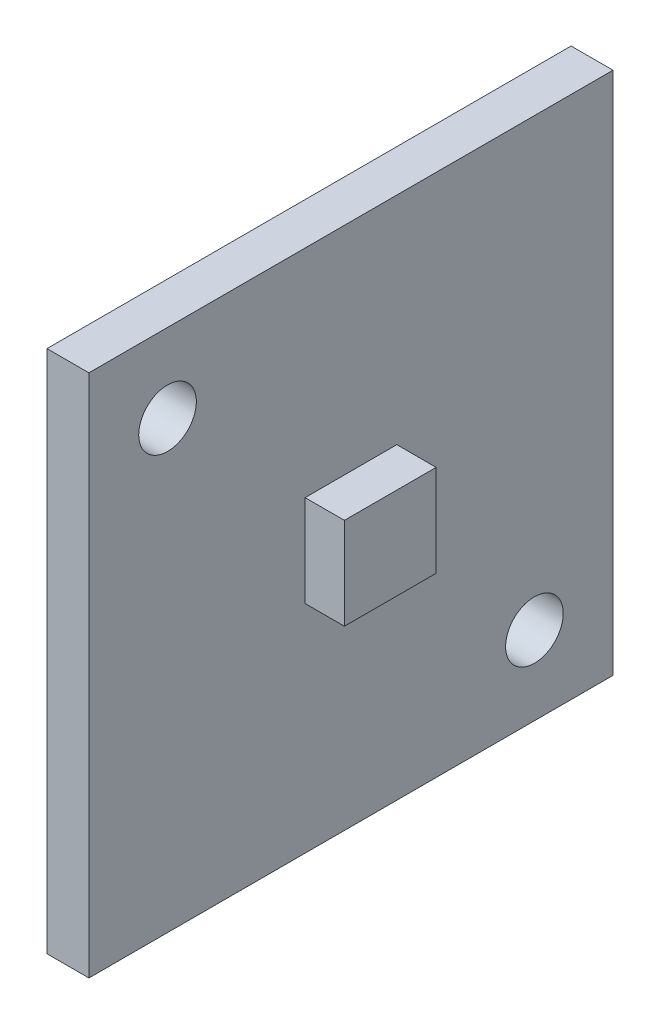
ISO-10303-21;
HEADER;
FILE_DESCRIPTION(('STEP AP214'),'2;1');
FILE_NAME('part.step','',(''),(''),'','','');
FILE_SCHEMA(('AUTOMOTIVE_DESIGN { 1 0 10303 214 1 1 1 1 }'));
ENDSEC;
DATA;
#1=APPLICATION_CONTEXT('core data for automotive mechanical design processes');
#2=APPLICATION_PROTOCOL_DEFINITION('international standard','automotive_design',2000,#1);
#3=PRODUCT_CONTEXT('',#1,'mechanical');
#4=PRODUCT('Part','Part','',(#3));
#5=PRODUCT_RELATED_PRODUCT_CATEGORY('part','',(#4));
#6=PRODUCT_DEFINITION_FORMATION('','',#4);
#7=PRODUCT_DEFINITION_CONTEXT('part definition',#1,'design');
#8=PRODUCT_DEFINITION('design','',#6,#7);
#9=PRODUCT_DEFINITION_SHAPE('','',#8);
#10=(LENGTH_UNIT() NAMED_UNIT(*) SI_UNIT(.MILLI.,.METRE.));
#11=(NAMED_UNIT(*) PLANE_ANGLE_UNIT() SI_UNIT($,.RADIAN.));
#12=(NAMED_UNIT(*) SI_UNIT($,.STERADIAN.) SOLID_ANGLE_UNIT());
#13=UNCERTAINTY_MEASURE_WITH_UNIT(LENGTH_MEASURE(1.E-05),#10,'distance_accuracy_value','');
#14=(GEOMETRIC_REPRESENTATION_CONTEXT(3) GLOBAL_UNCERTAINTY_ASSIGNED_CONTEXT((#13)) GLOBAL_UNIT_ASSIGNED_CONTEXT((#10,
#11,#12)) REPRESENTATION_CONTEXT('',''));
#15=CARTESIAN_POINT('',(0.,0.,0.));
#16=DIRECTION('',(0.,0.,1.));
#17=DIRECTION('',(1.,0.,0.));
#18=AXIS2_PLACEMENT_3D('',#15,#16,#17);
#19=CARTESIAN_POINT('',(0.,0.,0.));
#20=DIRECTION('',(-1.,0.,0.));
#21=DIRECTION('',(0.,0.,1.));
#22=AXIS2_PLACEMENT_3D('',#19,#20,#21);
#23=PLANE('',#22);
#24=CARTESIAN_POINT('',(0.,-7.,-7.));
#25=DIRECTION('',(-1.,0.,0.));
#26=DIRECTION('',(0.,0.,1.));
#27=AXIS2_PLACEMENT_3D('',#24,#25,#26);
#28=CIRCLE('',#27,1.1);
#29=CARTESIAN_POINT('',(0.,-7.,-5.9));
#30=VERTEX_POINT('',#29);
#31=EDGE_CURVE('E226',#30,#30,#28,.F.);
#32=ORIENTED_EDGE('',*,*,#31,.F.);
#33=EDGE_LOOP('',(#32));
#34=FACE_BOUND('',#33,.T.);
#35=CARTESIAN_POINT('',(0.,7.,7.));
#36=DIRECTION('',(-1.,0.,0.));
#37=DIRECTION('',(0.,0.,1.));
#38=AXIS2_PLACEMENT_3D('',#35,#36,#37);
#39=CIRCLE('',#38,1.1);
#40=CARTESIAN_POINT('',(0.,7.,8.1));
#41=VERTEX_POINT('',#40);
#42=EDGE_CURVE('E228',#41,#41,#39,.F.);
#43=ORIENTED_EDGE('',*,*,#42,.F.);
#44=EDGE_LOOP('',(#43));
#45=FACE_BOUND('',#44,.T.);
#46=DIRECTION('',(0.,1.,0.));
#47=VECTOR('',#46,1.);
#48=CARTESIAN_POINT('',(0.,-10.,-10.));
#49=LINE('',#48,#47);
#50=CARTESIAN_POINT('',(0.,-10.,-10.));
#51=VERTEX_POINT('',#50);
#52=CARTESIAN_POINT('',(0.,10.,-10.));
#53=VERTEX_POINT('',#52);
#54=EDGE_CURVE('E135',#51,#53,#49,.T.);
#55=ORIENTED_EDGE('',*,*,#54,.T.);
#56=DIRECTION('',(0.,0.,1.));
#57=VECTOR('',#56,1.);
#58=CARTESIAN_POINT('',(0.,10.,10.));
#59=LINE('',#58,#57);
#60=CARTESIAN_POINT('',(0.,10.,10.));
#61=VERTEX_POINT('',#60);
#62=EDGE_CURVE('E138',#53,#61,#59,.T.);
#63=ORIENTED_EDGE('',*,*,#62,.T.);
#64=DIRECTION('',(0.,-1.,0.));
#65=VECTOR('',#64,1.);
#66=CARTESIAN_POINT('',(0.,-10.,10.));
#67=LINE('',#66,#65);
#68=CARTESIAN_POINT('',(0.,-10.,10.));
#69=VERTEX_POINT('',#68);
#70=EDGE_CURVE('E160',#61,#69,#67,.T.);
#71=ORIENTED_EDGE('',*,*,#70,.T.);
#72=DIRECTION('',(0.,0.,-1.));
#73=VECTOR('',#72,1.);
#74=CARTESIAN_POINT('',(0.,-10.,10.));
#75=LINE('',#74,#73);
#76=EDGE_CURVE('E148',#69,#51,#75,.T.);
#77=ORIENTED_EDGE('',*,*,#76,.T.);
#78=EDGE_LOOP('',(#55,#63,#71,#77));
#79=FACE_BOUND('',#78,.T.);
#80=DIRECTION('',(0.,-1.,0.));
#81=VECTOR('',#80,1.);
#82=CARTESIAN_POINT('',(0.,1.75,1.75));
#83=LINE('',#82,#81);
#84=CARTESIAN_POINT('',(0.,1.75,1.75));
#85=VERTEX_POINT('',#84);
#86=CARTESIAN_POINT('',(0.,-1.75,1.75));
#87=VERTEX_POINT('',#86);
#88=EDGE_CURVE('E61',#85,#87,#83,.T.);
#89=ORIENTED_EDGE('',*,*,#88,.F.);
#90=DIRECTION('',(0.,0.,1.));
#91=VECTOR('',#90,1.);
#92=CARTESIAN_POINT('',(0.,1.75,-1.75));
#93=LINE('',#92,#91);
#94=CARTESIAN_POINT('',(0.,1.75,-1.75));
#95=VERTEX_POINT('',#94);
#96=EDGE_CURVE('E67',#95,#85,#93,.T.);
#97=ORIENTED_EDGE('',*,*,#96,.F.);
#98=DIRECTION('',(0.,1.,0.));
#99=VECTOR('',#98,1.);
#100=CARTESIAN_POINT('',(0.,-1.75,-1.75));
#101=LINE('',#100,#99);
#102=CARTESIAN_POINT('',(0.,-1.75,-1.75));
#103=VERTEX_POINT('',#102);
#104=EDGE_CURVE('E244',#103,#95,#101,.T.);
#105=ORIENTED_EDGE('',*,*,#104,.F.);
#106=DIRECTION('',(0.,0.,-1.));
#107=VECTOR('',#106,1.);
#108=CARTESIAN_POINT('',(0.,-1.75,1.75));
#109=LINE('',#108,#107);
#110=EDGE_CURVE('E234',#87,#103,#109,.T.);
#111=ORIENTED_EDGE('',*,*,#110,.F.);
#112=EDGE_LOOP('',(#89,#97,#105,#111));
#113=FACE_BOUND('',#112,.T.);
#114=ADVANCED_FACE('F50',(#34,#45,#79,#113),#23,.F.);
#115=CARTESIAN_POINT('',(-1.6,-10.,-10.));
#116=DIRECTION('',(0.,0.,-1.));
#117=DIRECTION('',(-1.,0.,0.));
#118=AXIS2_PLACEMENT_3D('',#115,#116,#117);
#119=PLANE('',#118);
#120=ORIENTED_EDGE('',*,*,#54,.F.);
#121=DIRECTION('',(1.,0.,0.));
#122=VECTOR('',#121,1.);
#123=CARTESIAN_POINT('',(-1.6,-10.,-10.));
#124=LINE('',#123,#122);
#125=CARTESIAN_POINT('',(-1.6,-10.,-10.));
#126=VERTEX_POINT('',#125);
#127=EDGE_CURVE('E11',#126,#51,#124,.T.);
#128=ORIENTED_EDGE('',*,*,#127,.F.);
#129=DIRECTION('',(0.,1.,0.));
#130=VECTOR('',#129,1.);
#131=CARTESIAN_POINT('',(-1.6,-10.,-10.));
#132=LINE('',#131,#130);
#133=CARTESIAN_POINT('',(-1.6,10.,-10.));
#134=VERTEX_POINT('',#133);
#135=EDGE_CURVE('E142',#126,#134,#132,.T.);
#136=ORIENTED_EDGE('',*,*,#135,.T.);
#137=DIRECTION('',(1.,0.,0.));
#138=VECTOR('',#137,1.);
#139=CARTESIAN_POINT('',(-1.6,10.,-10.));
#140=LINE('',#139,#138);
#141=EDGE_CURVE('E51',#134,#53,#140,.T.);
#142=ORIENTED_EDGE('',*,*,#141,.T.);
#143=EDGE_LOOP('',(#120,#128,#136,#142));
#144=FACE_BOUND('',#143,.T.);
#145=ADVANCED_FACE('F47',(#144),#119,.T.);
#146=CARTESIAN_POINT('',(-1.6,-10.,10.));
#147=DIRECTION('',(0.,-1.,0.));
#148=DIRECTION('',(0.,0.,-1.));
#149=AXIS2_PLACEMENT_3D('',#146,#147,#148);
#150=PLANE('',#149);
#151=ORIENTED_EDGE('',*,*,#76,.F.);
#152=DIRECTION('',(1.,0.,0.));
#153=VECTOR('',#152,1.);
#154=CARTESIAN_POINT('',(-1.6,-10.,10.));
#155=LINE('',#154,#153);
#156=CARTESIAN_POINT('',(-1.6,-10.,10.));
#157=VERTEX_POINT('',#156);
#158=EDGE_CURVE('E57',#157,#69,#155,.T.);
#159=ORIENTED_EDGE('',*,*,#158,.F.);
#160=DIRECTION('',(0.,0.,-1.));
#161=VECTOR('',#160,1.);
#162=CARTESIAN_POINT('',(-1.6,-10.,10.));
#163=LINE('',#162,#161);
#164=EDGE_CURVE('E155',#157,#126,#163,.T.);
#165=ORIENTED_EDGE('',*,*,#164,.T.);
#166=ORIENTED_EDGE('',*,*,#127,.T.);
#167=EDGE_LOOP('',(#151,#159,#165,#166));
#168=FACE_BOUND('',#167,.T.);
#169=ADVANCED_FACE('F171',(#168),#150,.T.);
#170=CARTESIAN_POINT('',(-1.6,-10.,10.));
#171=DIRECTION('',(0.,0.,1.));
#172=DIRECTION('',(1.,0.,0.));
#173=AXIS2_PLACEMENT_3D('',#170,#171,#172);
#174=PLANE('',#173);
#175=ORIENTED_EDGE('',*,*,#70,.F.);
#176=DIRECTION('',(1.,0.,0.));
#177=VECTOR('',#176,1.);
#178=CARTESIAN_POINT('',(-1.6,10.,10.));
#179=LINE('',#178,#177);
#180=CARTESIAN_POINT('',(-1.6,10.,10.));
#181=VERTEX_POINT('',#180);
#182=EDGE_CURVE('E165',#181,#61,#179,.T.);
#183=ORIENTED_EDGE('',*,*,#182,.F.);
#184=DIRECTION('',(0.,-1.,0.));
#185=VECTOR('',#184,1.);
#186=CARTESIAN_POINT('',(-1.6,-10.,10.));
#187=LINE('',#186,#185);
#188=EDGE_CURVE('E149',#181,#157,#187,.T.);
#189=ORIENTED_EDGE('',*,*,#188,.T.);
#190=ORIENTED_EDGE('',*,*,#158,.T.);
#191=EDGE_LOOP('',(#175,#183,#189,#190));
#192=FACE_BOUND('',#191,.T.);
#193=ADVANCED_FACE('F176',(#192),#174,.T.);
#194=CARTESIAN_POINT('',(-1.6,10.,10.));
#195=DIRECTION('',(0.,1.,0.));
#196=DIRECTION('',(0.,0.,1.));
#197=AXIS2_PLACEMENT_3D('',#194,#195,#196);
#198=PLANE('',#197);
#199=ORIENTED_EDGE('',*,*,#62,.F.);
#200=ORIENTED_EDGE('',*,*,#141,.F.);
#201=DIRECTION('',(0.,0.,1.));
#202=VECTOR('',#201,1.);
#203=CARTESIAN_POINT('',(-1.6,10.,10.));
#204=LINE('',#203,#202);
#205=EDGE_CURVE('E144',#134,#181,#204,.T.);
#206=ORIENTED_EDGE('',*,*,#205,.T.);
#207=ORIENTED_EDGE('',*,*,#182,.T.);
#208=EDGE_LOOP('',(#199,#200,#206,#207));
#209=FACE_BOUND('',#208,.T.);
#210=ADVANCED_FACE('F168',(#209),#198,.T.);
#211=CARTESIAN_POINT('',(-1.6,0.,0.));
#212=DIRECTION('',(-1.,0.,0.));
#213=DIRECTION('',(0.,0.,1.));
#214=AXIS2_PLACEMENT_3D('',#211,#212,#213);
#215=PLANE('',#214);
#216=CARTESIAN_POINT('',(-1.6,-7.,-7.));
#217=DIRECTION('',(1.,0.,0.));
#218=DIRECTION('',(0.,0.,-1.));
#219=AXIS2_PLACEMENT_3D('',#216,#217,#218);
#220=CIRCLE('',#219,1.1);
#221=CARTESIAN_POINT('',(-1.6,-7.,-8.1));
#222=VERTEX_POINT('',#221);
#223=EDGE_CURVE('E229',#222,#222,#220,.T.);
#224=ORIENTED_EDGE('',*,*,#223,.T.);
#225=EDGE_LOOP('',(#224));
#226=FACE_BOUND('',#225,.T.);
#227=CARTESIAN_POINT('',(-1.6,7.,7.));
#228=DIRECTION('',(1.,0.,0.));
#229=DIRECTION('',(0.,0.,-1.));
#230=AXIS2_PLACEMENT_3D('',#227,#228,#229);
#231=CIRCLE('',#230,1.1);
#232=CARTESIAN_POINT('',(-1.6,7.,5.9));
#233=VERTEX_POINT('',#232);
#234=EDGE_CURVE('E249',#233,#233,#231,.T.);
#235=ORIENTED_EDGE('',*,*,#234,.T.);
#236=EDGE_LOOP('',(#235));
#237=FACE_BOUND('',#236,.T.);
#238=ORIENTED_EDGE('',*,*,#135,.F.);
#239=ORIENTED_EDGE('',*,*,#164,.F.);
#240=ORIENTED_EDGE('',*,*,#188,.F.);
#241=ORIENTED_EDGE('',*,*,#205,.F.);
#242=EDGE_LOOP('',(#238,#239,#240,#241));
#243=FACE_BOUND('',#242,.T.);
#244=ADVANCED_FACE('F179',(#226,#237,#243),#215,.T.);
#245=CARTESIAN_POINT('',(1.5,1.75,1.75));
#246=DIRECTION('',(0.,0.,-1.));
#247=DIRECTION('',(-1.,0.,0.));
#248=AXIS2_PLACEMENT_3D('',#245,#246,#247);
#249=PLANE('',#248);
#250=ORIENTED_EDGE('',*,*,#88,.T.);
#251=DIRECTION('',(-1.,0.,0.));
#252=VECTOR('',#251,1.);
#253=CARTESIAN_POINT('',(1.5,-1.75,1.75));
#254=LINE('',#253,#252);
#255=CARTESIAN_POINT('',(1.5,-1.75,1.75));
#256=VERTEX_POINT('',#255);
#257=EDGE_CURVE('E117',#256,#87,#254,.T.);
#258=ORIENTED_EDGE('',*,*,#257,.F.);
#259=DIRECTION('',(0.,-1.,0.));
#260=VECTOR('',#259,1.);
#261=CARTESIAN_POINT('',(1.5,1.75,1.75));
#262=LINE('',#261,#260);
#263=CARTESIAN_POINT('',(1.5,1.75,1.75));
#264=VERTEX_POINT('',#263);
#265=EDGE_CURVE('E124',#264,#256,#262,.T.);
#266=ORIENTED_EDGE('',*,*,#265,.F.);
#267=DIRECTION('',(-1.,0.,0.));
#268=VECTOR('',#267,1.);
#269=CARTESIAN_POINT('',(1.5,1.75,1.75));
#270=LINE('',#269,#268);
#271=EDGE_CURVE('E239',#264,#85,#270,.T.);
#272=ORIENTED_EDGE('',*,*,#271,.T.);
#273=EDGE_LOOP('',(#250,#258,#266,#272));
#274=FACE_BOUND('',#273,.T.);
#275=ADVANCED_FACE('F134',(#274),#249,.F.);
#276=CARTESIAN_POINT('',(1.5,-1.75,1.75));
#277=DIRECTION('',(0.,1.,0.));
#278=DIRECTION('',(0.,0.,1.));
#279=AXIS2_PLACEMENT_3D('',#276,#277,#278);
#280=PLANE('',#279);
#281=ORIENTED_EDGE('',*,*,#110,.T.);
#282=DIRECTION('',(-1.,0.,0.));
#283=VECTOR('',#282,1.);
#284=CARTESIAN_POINT('',(1.5,-1.75,-1.75));
#285=LINE('',#284,#283);
#286=CARTESIAN_POINT('',(1.5,-1.75,-1.75));
#287=VERTEX_POINT('',#286);
#288=EDGE_CURVE('E120',#287,#103,#285,.T.);
#289=ORIENTED_EDGE('',*,*,#288,.F.);
#290=DIRECTION('',(0.,0.,-1.));
#291=VECTOR('',#290,1.);
#292=CARTESIAN_POINT('',(1.5,-1.75,1.75));
#293=LINE('',#292,#291);
#294=EDGE_CURVE('E112',#256,#287,#293,.T.);
#295=ORIENTED_EDGE('',*,*,#294,.F.);
#296=ORIENTED_EDGE('',*,*,#257,.T.);
#297=EDGE_LOOP('',(#281,#289,#295,#296));
#298=FACE_BOUND('',#297,.T.);
#299=ADVANCED_FACE('F111',(#298),#280,.F.);
#300=CARTESIAN_POINT('',(1.5,-1.75,-1.75));
#301=DIRECTION('',(0.,0.,1.));
#302=DIRECTION('',(1.,0.,0.));
#303=AXIS2_PLACEMENT_3D('',#300,#301,#302);
#304=PLANE('',#303);
#305=ORIENTED_EDGE('',*,*,#104,.T.);
#306=DIRECTION('',(-1.,0.,0.));
#307=VECTOR('',#306,1.);
#308=CARTESIAN_POINT('',(1.5,1.75,-1.75));
#309=LINE('',#308,#307);
#310=CARTESIAN_POINT('',(1.5,1.75,-1.75));
#311=VERTEX_POINT('',#310);
#312=EDGE_CURVE('E137',#311,#95,#309,.T.);
#313=ORIENTED_EDGE('',*,*,#312,.F.);
#314=DIRECTION('',(0.,1.,0.));
#315=VECTOR('',#314,1.);
#316=CARTESIAN_POINT('',(1.5,-1.75,-1.75));
#317=LINE('',#316,#315);
#318=EDGE_CURVE('E123',#287,#311,#317,.T.);
#319=ORIENTED_EDGE('',*,*,#318,.F.);
#320=ORIENTED_EDGE('',*,*,#288,.T.);
#321=EDGE_LOOP('',(#305,#313,#319,#320));
#322=FACE_BOUND('',#321,.T.);
#323=ADVANCED_FACE('F202',(#322),#304,.F.);
#324=CARTESIAN_POINT('',(1.5,1.75,-1.75));
#325=DIRECTION('',(0.,-1.,0.));
#326=DIRECTION('',(0.,0.,-1.));
#327=AXIS2_PLACEMENT_3D('',#324,#325,#326);
#328=PLANE('',#327);
#329=ORIENTED_EDGE('',*,*,#96,.T.);
#330=ORIENTED_EDGE('',*,*,#271,.F.);
#331=DIRECTION('',(0.,0.,1.));
#332=VECTOR('',#331,1.);
#333=CARTESIAN_POINT('',(1.5,1.75,-1.75));
#334=LINE('',#333,#332);
#335=EDGE_CURVE('E130',#311,#264,#334,.T.);
#336=ORIENTED_EDGE('',*,*,#335,.F.);
#337=ORIENTED_EDGE('',*,*,#312,.T.);
#338=EDGE_LOOP('',(#329,#330,#336,#337));
#339=FACE_BOUND('',#338,.T.);
#340=ADVANCED_FACE('F208',(#339),#328,.F.);
#341=CARTESIAN_POINT('',(1.5,0.,0.));
#342=DIRECTION('',(1.,0.,0.));
#343=DIRECTION('',(0.,0.,-1.));
#344=AXIS2_PLACEMENT_3D('',#341,#342,#343);
#345=PLANE('',#344);
#346=ORIENTED_EDGE('',*,*,#265,.T.);
#347=ORIENTED_EDGE('',*,*,#294,.T.);
#348=ORIENTED_EDGE('',*,*,#318,.T.);
#349=ORIENTED_EDGE('',*,*,#335,.T.);
#350=EDGE_LOOP('',(#346,#347,#348,#349));
#351=FACE_BOUND('',#350,.T.);
#352=ADVANCED_FACE('F121',(#351),#345,.T.);
#353=CARTESIAN_POINT('',(1.5,7.,7.));
#354=DIRECTION('',(-1.,0.,0.));
#355=DIRECTION('',(0.,0.,1.));
#356=AXIS2_PLACEMENT_3D('',#353,#354,#355);
#357=CYLINDRICAL_SURFACE('',#356,1.1);
#358=ORIENTED_EDGE('',*,*,#234,.F.);
#359=EDGE_LOOP('',(#358));
#360=FACE_BOUND('',#359,.T.);
#361=ORIENTED_EDGE('',*,*,#42,.T.);
#362=EDGE_LOOP('',(#361));
#363=FACE_BOUND('',#362,.T.);
#364=ADVANCED_FACE('F214',(#360,#363),#357,.F.);
#365=CARTESIAN_POINT('',(1.5,-7.,-7.));
#366=DIRECTION('',(-1.,0.,0.));
#367=DIRECTION('',(0.,0.,1.));
#368=AXIS2_PLACEMENT_3D('',#365,#366,#367);
#369=CYLINDRICAL_SURFACE('',#368,1.1);
#370=ORIENTED_EDGE('',*,*,#223,.F.);
#371=EDGE_LOOP('',(#370));
#372=FACE_BOUND('',#371,.T.);
#373=ORIENTED_EDGE('',*,*,#31,.T.);
#374=EDGE_LOOP('',(#373));
#375=FACE_BOUND('',#374,.T.);
#376=ADVANCED_FACE('F217',(#372,#375),#369,.F.);
#377=CLOSED_SHELL('',(#114,#145,#169,#193,#210,#244,#275,#299,#323,#340,#352,#364,#376));
#378=MANIFOLD_SOLID_BREP('B2',#377);
#379=ADVANCED_BREP_SHAPE_REPRESENTATION('',(#18,#378),#14);
#380=SHAPE_DEFINITION_REPRESENTATION(#9,#379);
ENDSEC;
END-ISO-10303-21;
